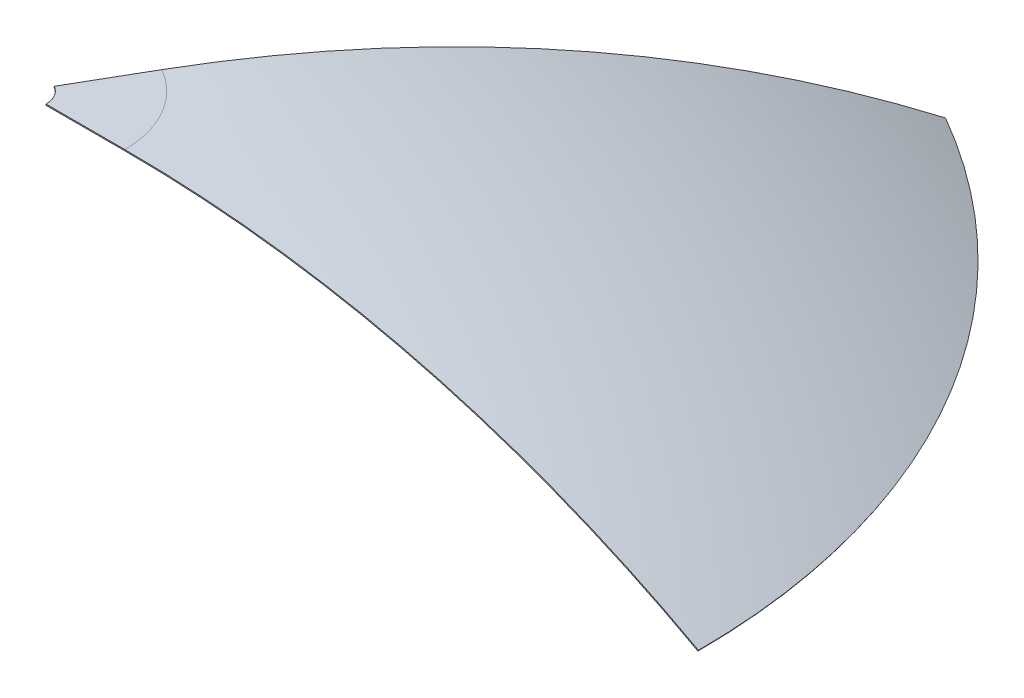
ISO-10303-21;
HEADER;
FILE_DESCRIPTION(('STEP AP214'),'2;1');
FILE_NAME('part.step','',(''),(''),'','','');
FILE_SCHEMA(('AUTOMOTIVE_DESIGN { 1 0 10303 214 1 1 1 1 }'));
ENDSEC;
DATA;
#1=APPLICATION_CONTEXT('core data for automotive mechanical design processes');
#2=APPLICATION_PROTOCOL_DEFINITION('international standard','automotive_design',2000,#1);
#3=PRODUCT_CONTEXT('',#1,'mechanical');
#4=PRODUCT('Part','Part','',(#3));
#5=PRODUCT_RELATED_PRODUCT_CATEGORY('part','',(#4));
#6=PRODUCT_DEFINITION_FORMATION('','',#4);
#7=PRODUCT_DEFINITION_CONTEXT('part definition',#1,'design');
#8=PRODUCT_DEFINITION('design','',#6,#7);
#9=PRODUCT_DEFINITION_SHAPE('','',#8);
#10=(LENGTH_UNIT() NAMED_UNIT(*) SI_UNIT(.MILLI.,.METRE.));
#11=(NAMED_UNIT(*) PLANE_ANGLE_UNIT() SI_UNIT($,.RADIAN.));
#12=(NAMED_UNIT(*) SI_UNIT($,.STERADIAN.) SOLID_ANGLE_UNIT());
#13=UNCERTAINTY_MEASURE_WITH_UNIT(LENGTH_MEASURE(1.E-05),#10,'distance_accuracy_value','');
#14=(GEOMETRIC_REPRESENTATION_CONTEXT(3) GLOBAL_UNCERTAINTY_ASSIGNED_CONTEXT((#13)) GLOBAL_UNIT_ASSIGNED_CONTEXT((#10,
#11,#12)) REPRESENTATION_CONTEXT('',''));
#15=CARTESIAN_POINT('',(0.,0.,0.));
#16=DIRECTION('',(0.,0.,1.));
#17=DIRECTION('',(1.,0.,0.));
#18=AXIS2_PLACEMENT_3D('',#15,#16,#17);
#19=CARTESIAN_POINT('',(2.25194248463671E-13,-65.6495340533063,0.));
#20=DIRECTION('',(0.,1.,0.));
#21=DIRECTION('',(-1.,0.,0.));
#22=AXIS2_PLACEMENT_3D('',#19,#20,#21);
#23=CONICAL_SURFACE('',#22,299.5,0.501217215294009);
#24=CARTESIAN_POINT('',(2.23690087111358E-13,-65.2110348793975,0.));
#25=DIRECTION('',(0.,-1.,0.));
#26=DIRECTION('',(1.,0.,0.));
#27=AXIS2_PLACEMENT_3D('',#24,#25,#26);
#28=CIRCLE('',#27,299.740246695047);
#29=CARTESIAN_POINT('',(149.870123347523,-65.211034879397,-259.582668174526));
#30=VERTEX_POINT('',#29);
#31=CARTESIAN_POINT('',(299.740246695048,-65.2110348793965,0.));
#32=VERTEX_POINT('',#31);
#33=EDGE_CURVE('E53',#30,#32,#28,.T.);
#34=ORIENTED_EDGE('',*,*,#33,.T.);
#35=DIRECTION('',(0.480493390094984,0.876998347817731,0.));
#36=VECTOR('',#35,1.);
#37=CARTESIAN_POINT('',(299.740246695048,-65.2110348793965,0.));
#38=LINE('',#37,#36);
#39=CARTESIAN_POINT('',(299.5,-65.6495340533053,0.));
#40=VERTEX_POINT('',#39);
#41=EDGE_CURVE('E107',#40,#32,#38,.T.);
#42=ORIENTED_EDGE('',*,*,#41,.F.);
#43=CARTESIAN_POINT('',(2.25194248463671E-13,-65.6495340533063,0.));
#44=DIRECTION('',(0.,-1.,0.));
#45=DIRECTION('',(1.,0.,0.));
#46=AXIS2_PLACEMENT_3D('',#43,#44,#45);
#47=CIRCLE('',#46,299.5);
#48=CARTESIAN_POINT('',(149.75,-65.6495340533058,-259.37460843344));
#49=VERTEX_POINT('',#48);
#50=EDGE_CURVE('E11',#49,#40,#47,.T.);
#51=ORIENTED_EDGE('',*,*,#50,.F.);
#52=DIRECTION('',(0.24024669504749,0.87699834781773,-0.416119482172766));
#53=VECTOR('',#52,1.);
#54=CARTESIAN_POINT('',(149.870123347523,-65.211034879397,-259.582668174526));
#55=LINE('',#54,#53);
#56=EDGE_CURVE('E134',#49,#30,#55,.T.);
#57=ORIENTED_EDGE('',*,*,#56,.T.);
#58=EDGE_LOOP('',(#34,#42,#51,#57));
#59=FACE_BOUND('',#58,.T.);
#60=ADVANCED_FACE('F45',(#59),#23,.T.);
#61=CARTESIAN_POINT('',(1.81799020282369E-12,-530.163893918988,0.));
#62=DIRECTION('',(0.,-1.,0.));
#63=DIRECTION('',(1.,0.,0.));
#64=AXIS2_PLACEMENT_3D('',#61,#62,#63);
#65=DEGENERATE_TOROIDAL_SURFACE('',#64,44.9999999999982,530.163893918988,.T.);
#66=CARTESIAN_POINT('',(0.,-2.22044604925031E-13,0.));
#67=DIRECTION('',(0.,-1.,0.));
#68=DIRECTION('',(1.,0.,0.));
#69=AXIS2_PLACEMENT_3D('',#66,#67,#68);
#70=CIRCLE('',#69,45.);
#71=CARTESIAN_POINT('',(22.4999999999999,0.,-38.9711431702998));
#72=VERTEX_POINT('',#71);
#73=CARTESIAN_POINT('',(45.,0.,0.));
#74=VERTEX_POINT('',#73);
#75=EDGE_CURVE('E158',#72,#74,#70,.T.);
#76=ORIENTED_EDGE('',*,*,#75,.T.);
#77=CARTESIAN_POINT('',(45.,-530.163893918988,0.));
#78=DIRECTION('',(0.,0.,1.));
#79=DIRECTION('',(1.,0.,0.));
#80=AXIS2_PLACEMENT_3D('',#77,#78,#79);
#81=CIRCLE('',#80,530.163893918988);
#82=EDGE_CURVE('E118',#32,#74,#81,.T.);
#83=ORIENTED_EDGE('',*,*,#82,.F.);
#84=ORIENTED_EDGE('',*,*,#33,.F.);
#85=CARTESIAN_POINT('',(22.5000000000008,-530.163893918988,-38.9711431702982));
#86=DIRECTION('',(0.86602540378444,0.,0.499999999999998));
#87=DIRECTION('',(0.499999999999998,0.,-0.86602540378444));
#88=AXIS2_PLACEMENT_3D('',#85,#86,#87);
#89=CIRCLE('',#88,530.163893918988);
#90=EDGE_CURVE('E137',#30,#72,#89,.T.);
#91=ORIENTED_EDGE('',*,*,#90,.T.);
#92=EDGE_LOOP('',(#76,#83,#84,#91));
#93=FACE_BOUND('',#92,.T.);
#94=ADVANCED_FACE('F165',(#93),#65,.T.);
#95=CARTESIAN_POINT('',(4.99999999999998,0.,-8.6602540378444));
#96=DIRECTION('',(0.,1.,0.));
#97=DIRECTION('',(-1.,0.,0.));
#98=AXIS2_PLACEMENT_3D('',#95,#96,#97);
#99=PLANE('',#98);
#100=CARTESIAN_POINT('',(0.,0.,0.));
#101=DIRECTION('',(0.,-1.,0.));
#102=DIRECTION('',(1.,0.,0.));
#103=AXIS2_PLACEMENT_3D('',#100,#101,#102);
#104=CIRCLE('',#103,10.);
#105=CARTESIAN_POINT('',(4.99999999999998,0.,-8.6602540378444));
#106=VERTEX_POINT('',#105);
#107=CARTESIAN_POINT('',(10.,0.,0.));
#108=VERTEX_POINT('',#107);
#109=EDGE_CURVE('E155',#106,#108,#104,.T.);
#110=ORIENTED_EDGE('',*,*,#109,.T.);
#111=DIRECTION('',(-1.,0.,0.));
#112=VECTOR('',#111,1.);
#113=CARTESIAN_POINT('',(10.,0.,0.));
#114=LINE('',#113,#112);
#115=EDGE_CURVE('E121',#74,#108,#114,.T.);
#116=ORIENTED_EDGE('',*,*,#115,.F.);
#117=ORIENTED_EDGE('',*,*,#75,.F.);
#118=DIRECTION('',(-0.499999999999998,0.,0.86602540378444));
#119=VECTOR('',#118,1.);
#120=CARTESIAN_POINT('',(4.99999999999998,0.,-8.6602540378444));
#121=LINE('',#120,#119);
#122=EDGE_CURVE('E140',#72,#106,#121,.T.);
#123=ORIENTED_EDGE('',*,*,#122,.T.);
#124=EDGE_LOOP('',(#110,#116,#117,#123));
#125=FACE_BOUND('',#124,.T.);
#126=ADVANCED_FACE('F169',(#125),#99,.T.);
#127=CARTESIAN_POINT('',(3.43024899888577E-12,-1000.,0.));
#128=DIRECTION('',(0.,-1.,0.));
#129=DIRECTION('',(1.,0.,0.));
#130=AXIS2_PLACEMENT_3D('',#127,#128,#129);
#131=CYLINDRICAL_SURFACE('',#130,10.);
#132=CARTESIAN_POINT('',(0.,-0.500000000000056,0.));
#133=DIRECTION('',(0.,-1.,0.));
#134=DIRECTION('',(1.,0.,0.));
#135=AXIS2_PLACEMENT_3D('',#132,#133,#134);
#136=CIRCLE('',#135,10.);
#137=CARTESIAN_POINT('',(4.99999999999998,-0.500000000000024,-8.6602540378444));
#138=VERTEX_POINT('',#137);
#139=CARTESIAN_POINT('',(10.,-0.500000000000007,0.));
#140=VERTEX_POINT('',#139);
#141=EDGE_CURVE('E70',#138,#140,#136,.T.);
#142=ORIENTED_EDGE('',*,*,#141,.T.);
#143=DIRECTION('',(0.,-1.,0.));
#144=VECTOR('',#143,1.);
#145=CARTESIAN_POINT('',(10.,-0.500000000000007,0.));
#146=LINE('',#145,#144);
#147=EDGE_CURVE('E127',#108,#140,#146,.T.);
#148=ORIENTED_EDGE('',*,*,#147,.F.);
#149=ORIENTED_EDGE('',*,*,#109,.F.);
#150=DIRECTION('',(0.,-1.,0.));
#151=VECTOR('',#150,1.);
#152=CARTESIAN_POINT('',(4.99999999999998,-0.500000000000024,-8.6602540378444));
#153=LINE('',#152,#151);
#154=EDGE_CURVE('E144',#106,#138,#153,.T.);
#155=ORIENTED_EDGE('',*,*,#154,.T.);
#156=EDGE_LOOP('',(#142,#148,#149,#155));
#157=FACE_BOUND('',#156,.T.);
#158=ADVANCED_FACE('F172',(#157),#131,.F.);
#159=CARTESIAN_POINT('',(4.99999999999998,-0.500000000000084,-8.6602540378444));
#160=DIRECTION('',(0.,-1.,0.));
#161=DIRECTION('',(1.,0.,0.));
#162=AXIS2_PLACEMENT_3D('',#159,#160,#161);
#163=PLANE('',#162);
#164=CARTESIAN_POINT('',(0.,-0.500000000000167,0.));
#165=DIRECTION('',(0.,-1.,0.));
#166=DIRECTION('',(1.,0.,0.));
#167=AXIS2_PLACEMENT_3D('',#164,#165,#166);
#168=CIRCLE('',#167,45.);
#169=CARTESIAN_POINT('',(22.4999999999999,-0.500000000000084,-38.9711431702998));
#170=VERTEX_POINT('',#169);
#171=CARTESIAN_POINT('',(45.,-0.500000000000007,0.));
#172=VERTEX_POINT('',#171);
#173=EDGE_CURVE('E150',#170,#172,#168,.T.);
#174=ORIENTED_EDGE('',*,*,#173,.T.);
#175=DIRECTION('',(1.,0.,0.));
#176=VECTOR('',#175,1.);
#177=CARTESIAN_POINT('',(10.,-0.500000000000007,0.));
#178=LINE('',#177,#176);
#179=EDGE_CURVE('E110',#140,#172,#178,.T.);
#180=ORIENTED_EDGE('',*,*,#179,.F.);
#181=ORIENTED_EDGE('',*,*,#141,.F.);
#182=DIRECTION('',(0.499999999999998,0.,-0.86602540378444));
#183=VECTOR('',#182,1.);
#184=CARTESIAN_POINT('',(4.99999999999998,-0.500000000000024,-8.6602540378444));
#185=LINE('',#184,#183);
#186=EDGE_CURVE('E147',#138,#170,#185,.T.);
#187=ORIENTED_EDGE('',*,*,#186,.T.);
#188=EDGE_LOOP('',(#174,#180,#181,#187));
#189=FACE_BOUND('',#188,.T.);
#190=ADVANCED_FACE('F175',(#189),#163,.T.);
#191=CARTESIAN_POINT('',(1.81799020282369E-12,-530.163893918988,0.));
#192=DIRECTION('',(0.,-1.,0.));
#193=DIRECTION('',(1.,0.,0.));
#194=AXIS2_PLACEMENT_3D('',#191,#192,#193);
#195=DEGENERATE_TOROIDAL_SURFACE('',#194,44.9999999999982,529.663893918988,.T.);
#196=ORIENTED_EDGE('',*,*,#173,.F.);
#197=CARTESIAN_POINT('',(22.5000000000008,-530.163893918988,-38.9711431702982));
#198=DIRECTION('',(-0.86602540378444,0.,-0.499999999999998));
#199=DIRECTION('',(0.499999999999998,0.,-0.86602540378444));
#200=AXIS2_PLACEMENT_3D('',#197,#198,#199);
#201=CIRCLE('',#200,529.663893918988);
#202=EDGE_CURVE('E62',#170,#49,#201,.T.);
#203=ORIENTED_EDGE('',*,*,#202,.T.);
#204=ORIENTED_EDGE('',*,*,#50,.T.);
#205=CARTESIAN_POINT('',(45.,-530.163893918988,0.));
#206=DIRECTION('',(0.,0.,-1.));
#207=DIRECTION('',(1.,0.,0.));
#208=AXIS2_PLACEMENT_3D('',#205,#206,#207);
#209=CIRCLE('',#208,529.663893918988);
#210=EDGE_CURVE('E104',#172,#40,#209,.T.);
#211=ORIENTED_EDGE('',*,*,#210,.F.);
#212=EDGE_LOOP('',(#196,#203,#204,#211));
#213=FACE_BOUND('',#212,.T.);
#214=ADVANCED_FACE('F114',(#213),#195,.F.);
#215=CARTESIAN_POINT('',(22.5000000000008,-530.163893918988,-38.9711431702982));
#216=DIRECTION('',(0.86602540378444,0.,0.499999999999998));
#217=DIRECTION('',(0.499999999999998,0.,-0.86602540378444));
#218=AXIS2_PLACEMENT_3D('',#215,#216,#217);
#219=PLANE('',#218);
#220=ORIENTED_EDGE('',*,*,#202,.F.);
#221=ORIENTED_EDGE('',*,*,#186,.F.);
#222=ORIENTED_EDGE('',*,*,#154,.F.);
#223=ORIENTED_EDGE('',*,*,#122,.F.);
#224=ORIENTED_EDGE('',*,*,#90,.F.);
#225=ORIENTED_EDGE('',*,*,#56,.F.);
#226=EDGE_LOOP('',(#220,#221,#222,#223,#224,#225));
#227=FACE_BOUND('',#226,.T.);
#228=ADVANCED_FACE('F174',(#227),#219,.F.);
#229=CARTESIAN_POINT('',(45.,-530.163893918988,0.));
#230=DIRECTION('',(0.,0.,1.));
#231=DIRECTION('',(1.,0.,0.));
#232=AXIS2_PLACEMENT_3D('',#229,#230,#231);
#233=PLANE('',#232);
#234=ORIENTED_EDGE('',*,*,#210,.T.);
#235=ORIENTED_EDGE('',*,*,#41,.T.);
#236=ORIENTED_EDGE('',*,*,#82,.T.);
#237=ORIENTED_EDGE('',*,*,#115,.T.);
#238=ORIENTED_EDGE('',*,*,#147,.T.);
#239=ORIENTED_EDGE('',*,*,#179,.T.);
#240=EDGE_LOOP('',(#234,#235,#236,#237,#238,#239));
#241=FACE_BOUND('',#240,.T.);
#242=ADVANCED_FACE('F105',(#241),#233,.T.);
#243=CLOSED_SHELL('',(#60,#94,#126,#158,#190,#214,#228,#242));
#244=MANIFOLD_SOLID_BREP('B2',#243);
#245=ADVANCED_BREP_SHAPE_REPRESENTATION('',(#18,#244),#14);
#246=SHAPE_DEFINITION_REPRESENTATION(#9,#245);
ENDSEC;
END-ISO-10303-21;
